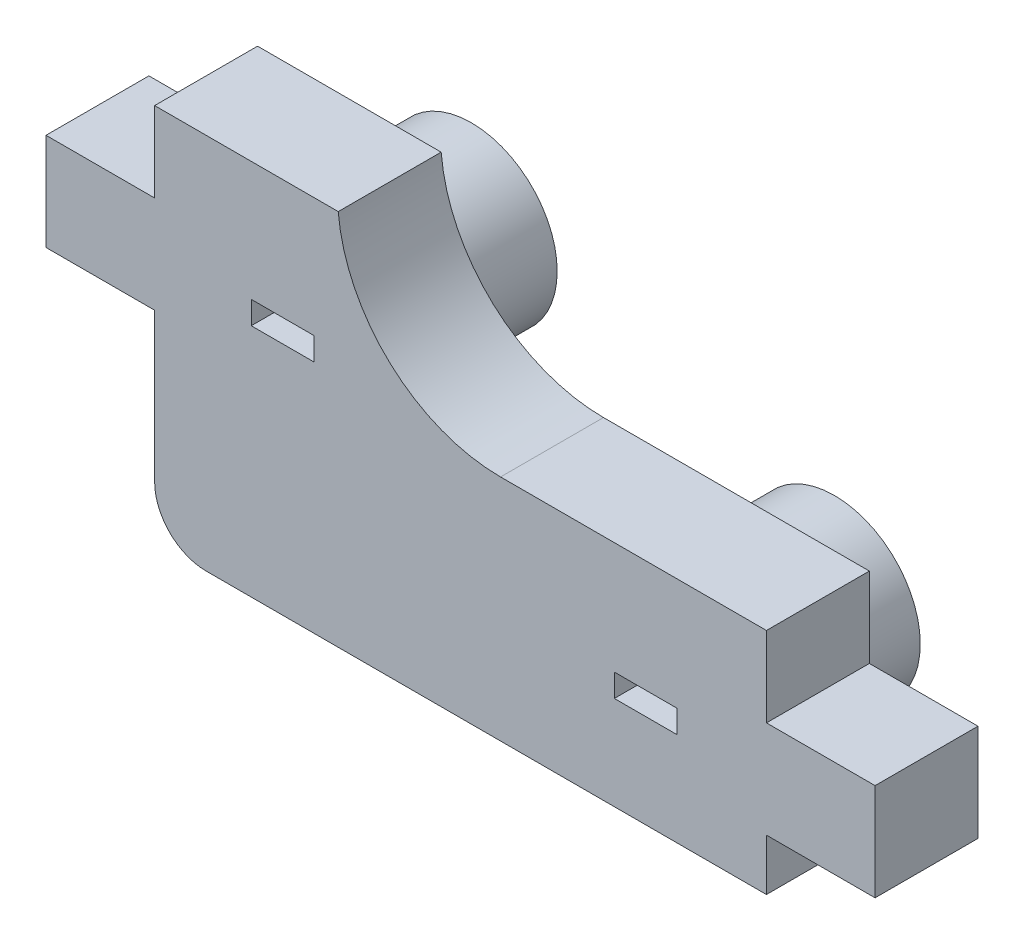
ISO-10303-21;
HEADER;
FILE_DESCRIPTION(('STEP AP214'),'2;1');
FILE_NAME('part.step','',(''),(''),'','','');
FILE_SCHEMA(('AUTOMOTIVE_DESIGN { 1 0 10303 214 1 1 1 1 }'));
ENDSEC;
DATA;
#1=APPLICATION_CONTEXT('core data for automotive mechanical design processes');
#2=APPLICATION_PROTOCOL_DEFINITION('international standard','automotive_design',2000,#1);
#3=PRODUCT_CONTEXT('',#1,'mechanical');
#4=PRODUCT('Part','Part','',(#3));
#5=PRODUCT_RELATED_PRODUCT_CATEGORY('part','',(#4));
#6=PRODUCT_DEFINITION_FORMATION('','',#4);
#7=PRODUCT_DEFINITION_CONTEXT('part definition',#1,'design');
#8=PRODUCT_DEFINITION('design','',#6,#7);
#9=PRODUCT_DEFINITION_SHAPE('','',#8);
#10=(LENGTH_UNIT() NAMED_UNIT(*) SI_UNIT(.MILLI.,.METRE.));
#11=(NAMED_UNIT(*) PLANE_ANGLE_UNIT() SI_UNIT($,.RADIAN.));
#12=(NAMED_UNIT(*) SI_UNIT($,.STERADIAN.) SOLID_ANGLE_UNIT());
#13=UNCERTAINTY_MEASURE_WITH_UNIT(LENGTH_MEASURE(1.E-05),#10,'distance_accuracy_value','');
#14=(GEOMETRIC_REPRESENTATION_CONTEXT(3) GLOBAL_UNCERTAINTY_ASSIGNED_CONTEXT((#13)) GLOBAL_UNIT_ASSIGNED_CONTEXT((#10,
#11,#12)) REPRESENTATION_CONTEXT('',''));
#15=CARTESIAN_POINT('',(0.,0.,0.));
#16=DIRECTION('',(0.,0.,1.));
#17=DIRECTION('',(1.,0.,0.));
#18=AXIS2_PLACEMENT_3D('',#15,#16,#17);
#19=CARTESIAN_POINT('',(0.,0.,1.8));
#20=DIRECTION('',(0.,0.,1.));
#21=DIRECTION('',(1.,0.,0.));
#22=AXIS2_PLACEMENT_3D('',#19,#20,#21);
#23=PLANE('',#22);
#24=DIRECTION('',(0.,-1.,0.));
#25=VECTOR('',#24,1.);
#26=CARTESIAN_POINT('',(-6.05,0.,1.8));
#27=LINE('',#26,#25);
#28=CARTESIAN_POINT('',(-6.05,-3.35,1.8));
#29=VERTEX_POINT('',#28);
#30=CARTESIAN_POINT('',(-6.05,-5.95,1.8));
#31=VERTEX_POINT('',#30);
#32=EDGE_CURVE('E271',#29,#31,#27,.T.);
#33=ORIENTED_EDGE('',*,*,#32,.T.);
#34=CARTESIAN_POINT('',(-5.15,-5.95,1.8));
#35=DIRECTION('',(0.,0.,1.));
#36=DIRECTION('',(1.,0.,0.));
#37=AXIS2_PLACEMENT_3D('',#34,#35,#36);
#38=CIRCLE('',#37,0.899999999999999);
#39=CARTESIAN_POINT('',(-5.15,-6.85,1.8));
#40=VERTEX_POINT('',#39);
#41=EDGE_CURVE('E274',#31,#40,#38,.T.);
#42=ORIENTED_EDGE('',*,*,#41,.T.);
#43=DIRECTION('',(-1.,0.,0.));
#44=VECTOR('',#43,1.);
#45=CARTESIAN_POINT('',(0.,-6.85,1.8));
#46=LINE('',#45,#44);
#47=CARTESIAN_POINT('',(4.65,-6.85,1.8));
#48=VERTEX_POINT('',#47);
#49=EDGE_CURVE('E277',#48,#40,#46,.T.);
#50=ORIENTED_EDGE('',*,*,#49,.F.);
#51=DIRECTION('',(0.,-1.,0.));
#52=VECTOR('',#51,1.);
#53=CARTESIAN_POINT('',(4.65,0.,1.8));
#54=LINE('',#53,#52);
#55=CARTESIAN_POINT('',(4.65,-5.95,1.8));
#56=VERTEX_POINT('',#55);
#57=EDGE_CURVE('E280',#56,#48,#54,.T.);
#58=ORIENTED_EDGE('',*,*,#57,.F.);
#59=DIRECTION('',(-1.,0.,0.));
#60=VECTOR('',#59,1.);
#61=CARTESIAN_POINT('',(0.,-5.95,1.8));
#62=LINE('',#61,#60);
#63=CARTESIAN_POINT('',(6.55,-5.95,1.8));
#64=VERTEX_POINT('',#63);
#65=EDGE_CURVE('E283',#64,#56,#62,.T.);
#66=ORIENTED_EDGE('',*,*,#65,.F.);
#67=DIRECTION('',(0.,-1.,0.));
#68=VECTOR('',#67,1.);
#69=CARTESIAN_POINT('',(6.55,0.,1.8));
#70=LINE('',#69,#68);
#71=CARTESIAN_POINT('',(6.55,-4.25,1.8));
#72=VERTEX_POINT('',#71);
#73=EDGE_CURVE('E286',#72,#64,#70,.T.);
#74=ORIENTED_EDGE('',*,*,#73,.F.);
#75=DIRECTION('',(1.,0.,0.));
#76=VECTOR('',#75,1.);
#77=CARTESIAN_POINT('',(0.,-4.24999999999999,1.8));
#78=LINE('',#77,#76);
#79=CARTESIAN_POINT('',(4.65,-4.25,1.8));
#80=VERTEX_POINT('',#79);
#81=EDGE_CURVE('E289',#80,#72,#78,.T.);
#82=ORIENTED_EDGE('',*,*,#81,.F.);
#83=DIRECTION('',(0.,-1.,0.));
#84=VECTOR('',#83,1.);
#85=CARTESIAN_POINT('',(4.65,0.,1.8));
#86=LINE('',#85,#84);
#87=CARTESIAN_POINT('',(4.65,-2.85,1.8));
#88=VERTEX_POINT('',#87);
#89=EDGE_CURVE('E292',#88,#80,#86,.T.);
#90=ORIENTED_EDGE('',*,*,#89,.F.);
#91=DIRECTION('',(1.,0.,0.));
#92=VECTOR('',#91,1.);
#93=CARTESIAN_POINT('',(0.,-2.85,1.8));
#94=LINE('',#93,#92);
#95=CARTESIAN_POINT('',(0.,-2.85,1.8));
#96=VERTEX_POINT('',#95);
#97=EDGE_CURVE('E295',#96,#88,#94,.T.);
#98=ORIENTED_EDGE('',*,*,#97,.F.);
#99=CARTESIAN_POINT('',(0.,0.,1.8));
#100=DIRECTION('',(0.,0.,1.));
#101=DIRECTION('',(1.,0.,0.));
#102=AXIS2_PLACEMENT_3D('',#99,#100,#101);
#103=CIRCLE('',#102,2.85);
#104=CARTESIAN_POINT('',(-2.83901391331568,-0.250000000000002,1.8));
#105=VERTEX_POINT('',#104);
#106=EDGE_CURVE('E298',#105,#96,#103,.T.);
#107=ORIENTED_EDGE('',*,*,#106,.F.);
#108=DIRECTION('',(1.,0.,0.));
#109=VECTOR('',#108,1.);
#110=CARTESIAN_POINT('',(0.,-0.250000000000002,1.8));
#111=LINE('',#110,#109);
#112=CARTESIAN_POINT('',(-6.05,-0.250000000000002,1.8));
#113=VERTEX_POINT('',#112);
#114=EDGE_CURVE('E301',#113,#105,#111,.T.);
#115=ORIENTED_EDGE('',*,*,#114,.F.);
#116=DIRECTION('',(0.,-1.,0.));
#117=VECTOR('',#116,1.);
#118=CARTESIAN_POINT('',(-6.05,0.,1.8));
#119=LINE('',#118,#117);
#120=CARTESIAN_POINT('',(-6.05,-1.65,1.8));
#121=VERTEX_POINT('',#120);
#122=EDGE_CURVE('E304',#113,#121,#119,.T.);
#123=ORIENTED_EDGE('',*,*,#122,.T.);
#124=DIRECTION('',(-1.,0.,0.));
#125=VECTOR('',#124,1.);
#126=CARTESIAN_POINT('',(0.,-1.65,1.8));
#127=LINE('',#126,#125);
#128=CARTESIAN_POINT('',(-7.95,-1.65,1.8));
#129=VERTEX_POINT('',#128);
#130=EDGE_CURVE('E306',#121,#129,#127,.T.);
#131=ORIENTED_EDGE('',*,*,#130,.T.);
#132=DIRECTION('',(0.,-1.,0.));
#133=VECTOR('',#132,1.);
#134=CARTESIAN_POINT('',(-7.95,0.,1.8));
#135=LINE('',#134,#133);
#136=CARTESIAN_POINT('',(-7.95,-3.35,1.8));
#137=VERTEX_POINT('',#136);
#138=EDGE_CURVE('E308',#129,#137,#135,.T.);
#139=ORIENTED_EDGE('',*,*,#138,.T.);
#140=DIRECTION('',(1.,0.,0.));
#141=VECTOR('',#140,1.);
#142=CARTESIAN_POINT('',(0.,-3.35,1.8));
#143=LINE('',#142,#141);
#144=EDGE_CURVE('E310',#137,#29,#143,.T.);
#145=ORIENTED_EDGE('',*,*,#144,.T.);
#146=EDGE_LOOP('',(#33,#42,#50,#58,#66,#74,#82,#90,#98,#107,#115,#123,#131,#139,#145));
#147=FACE_BOUND('',#146,.T.);
#148=DIRECTION('',(-1.,0.,0.));
#149=VECTOR('',#148,1.);
#150=CARTESIAN_POINT('',(3.08999999999999,-4.81000000000011,1.8));
#151=LINE('',#150,#149);
#152=CARTESIAN_POINT('',(3.08999999999999,-4.81000000000011,1.8));
#153=VERTEX_POINT('',#152);
#154=CARTESIAN_POINT('',(1.98999999999999,-4.81000000000011,1.8));
#155=VERTEX_POINT('',#154);
#156=EDGE_CURVE('E262',#153,#155,#151,.T.);
#157=ORIENTED_EDGE('',*,*,#156,.F.);
#158=DIRECTION('',(0.,1.,0.));
#159=VECTOR('',#158,1.);
#160=CARTESIAN_POINT('',(3.08999999999999,-5.21000000000011,1.8));
#161=LINE('',#160,#159);
#162=CARTESIAN_POINT('',(3.08999999999999,-5.21000000000011,1.8));
#163=VERTEX_POINT('',#162);
#164=EDGE_CURVE('E251',#163,#153,#161,.T.);
#165=ORIENTED_EDGE('',*,*,#164,.F.);
#166=DIRECTION('',(-1.,0.,0.));
#167=VECTOR('',#166,1.);
#168=CARTESIAN_POINT('',(3.08999999999999,-5.21000000000011,1.8));
#169=LINE('',#168,#167);
#170=CARTESIAN_POINT('',(1.98999999999999,-5.21000000000011,1.8));
#171=VERTEX_POINT('',#170);
#172=EDGE_CURVE('E246',#163,#171,#169,.T.);
#173=ORIENTED_EDGE('',*,*,#172,.T.);
#174=DIRECTION('',(0.,1.,0.));
#175=VECTOR('',#174,1.);
#176=CARTESIAN_POINT('',(1.98999999999999,-5.21000000000011,1.8));
#177=LINE('',#176,#175);
#178=EDGE_CURVE('E64',#171,#155,#177,.T.);
#179=ORIENTED_EDGE('',*,*,#178,.T.);
#180=EDGE_LOOP('',(#157,#165,#173,#179));
#181=FACE_BOUND('',#180,.T.);
#182=DIRECTION('',(-1.,0.,0.));
#183=VECTOR('',#182,1.);
#184=CARTESIAN_POINT('',(-3.25999999999998,-2.34000000000011,1.8));
#185=LINE('',#184,#183);
#186=CARTESIAN_POINT('',(-3.25999999999998,-2.34000000000011,1.8));
#187=VERTEX_POINT('',#186);
#188=CARTESIAN_POINT('',(-4.35999999999998,-2.34000000000011,1.8));
#189=VERTEX_POINT('',#188);
#190=EDGE_CURVE('E209',#187,#189,#185,.T.);
#191=ORIENTED_EDGE('',*,*,#190,.F.);
#192=DIRECTION('',(0.,1.,0.));
#193=VECTOR('',#192,1.);
#194=CARTESIAN_POINT('',(-3.25999999999998,-2.74000000000011,1.8));
#195=LINE('',#194,#193);
#196=CARTESIAN_POINT('',(-3.25999999999998,-2.74000000000011,1.8));
#197=VERTEX_POINT('',#196);
#198=EDGE_CURVE('E198',#197,#187,#195,.T.);
#199=ORIENTED_EDGE('',*,*,#198,.F.);
#200=DIRECTION('',(-1.,0.,0.));
#201=VECTOR('',#200,1.);
#202=CARTESIAN_POINT('',(-3.25999999999998,-2.74000000000011,1.8));
#203=LINE('',#202,#201);
#204=CARTESIAN_POINT('',(-4.35999999999998,-2.74000000000011,1.8));
#205=VERTEX_POINT('',#204);
#206=EDGE_CURVE('E220',#197,#205,#203,.T.);
#207=ORIENTED_EDGE('',*,*,#206,.T.);
#208=DIRECTION('',(0.,1.,0.));
#209=VECTOR('',#208,1.);
#210=CARTESIAN_POINT('',(-4.35999999999998,-2.74000000000011,1.8));
#211=LINE('',#210,#209);
#212=EDGE_CURVE('E56',#205,#189,#211,.T.);
#213=ORIENTED_EDGE('',*,*,#212,.T.);
#214=EDGE_LOOP('',(#191,#199,#207,#213));
#215=FACE_BOUND('',#214,.T.);
#216=ADVANCED_FACE('F41',(#147,#181,#215),#23,.T.);
#217=CARTESIAN_POINT('',(-6.05,0.,1.8));
#218=DIRECTION('',(1.,0.,0.));
#219=DIRECTION('',(0.,1.,0.));
#220=AXIS2_PLACEMENT_3D('',#217,#218,#219);
#221=PLANE('',#220);
#222=DIRECTION('',(0.,-1.,0.));
#223=VECTOR('',#222,1.);
#224=CARTESIAN_POINT('',(-6.05,0.,0.));
#225=LINE('',#224,#223);
#226=CARTESIAN_POINT('',(-6.05,-3.35,0.));
#227=VERTEX_POINT('',#226);
#228=CARTESIAN_POINT('',(-6.05,-5.95,0.));
#229=VERTEX_POINT('',#228);
#230=EDGE_CURVE('E270',#227,#229,#225,.T.);
#231=ORIENTED_EDGE('',*,*,#230,.T.);
#232=DIRECTION('',(0.,0.,-1.));
#233=VECTOR('',#232,1.);
#234=CARTESIAN_POINT('',(-6.05,-5.95,1.8));
#235=LINE('',#234,#233);
#236=EDGE_CURVE('E383',#31,#229,#235,.T.);
#237=ORIENTED_EDGE('',*,*,#236,.F.);
#238=ORIENTED_EDGE('',*,*,#32,.F.);
#239=DIRECTION('',(0.,0.,-1.));
#240=VECTOR('',#239,1.);
#241=CARTESIAN_POINT('',(-6.05,-3.35,1.8));
#242=LINE('',#241,#240);
#243=EDGE_CURVE('E312',#29,#227,#242,.T.);
#244=ORIENTED_EDGE('',*,*,#243,.T.);
#245=EDGE_LOOP('',(#231,#237,#238,#244));
#246=FACE_BOUND('',#245,.T.);
#247=ADVANCED_FACE('F43',(#246),#221,.F.);
#248=CARTESIAN_POINT('',(-5.15,-5.95,1.8));
#249=DIRECTION('',(0.,0.,-1.));
#250=DIRECTION('',(-1.,0.,0.));
#251=AXIS2_PLACEMENT_3D('',#248,#249,#250);
#252=CYLINDRICAL_SURFACE('',#251,0.899999999999999);
#253=CARTESIAN_POINT('',(-5.15,-5.95,0.));
#254=DIRECTION('',(0.,0.,1.));
#255=DIRECTION('',(1.,0.,0.));
#256=AXIS2_PLACEMENT_3D('',#253,#254,#255);
#257=CIRCLE('',#256,0.899999999999999);
#258=CARTESIAN_POINT('',(-5.15,-6.85,0.));
#259=VERTEX_POINT('',#258);
#260=EDGE_CURVE('E315',#229,#259,#257,.T.);
#261=ORIENTED_EDGE('',*,*,#260,.T.);
#262=DIRECTION('',(0.,0.,-1.));
#263=VECTOR('',#262,1.);
#264=CARTESIAN_POINT('',(-5.15,-6.85,1.8));
#265=LINE('',#264,#263);
#266=EDGE_CURVE('E381',#40,#259,#265,.T.);
#267=ORIENTED_EDGE('',*,*,#266,.F.);
#268=ORIENTED_EDGE('',*,*,#41,.F.);
#269=ORIENTED_EDGE('',*,*,#236,.T.);
#270=EDGE_LOOP('',(#261,#267,#268,#269));
#271=FACE_BOUND('',#270,.T.);
#272=ADVANCED_FACE('F457',(#271),#252,.T.);
#273=CARTESIAN_POINT('',(0.,-6.85,1.8));
#274=DIRECTION('',(0.,-1.,0.));
#275=DIRECTION('',(1.,0.,0.));
#276=AXIS2_PLACEMENT_3D('',#273,#274,#275);
#277=PLANE('',#276);
#278=DIRECTION('',(-1.,0.,0.));
#279=VECTOR('',#278,1.);
#280=CARTESIAN_POINT('',(0.,-6.85,0.));
#281=LINE('',#280,#279);
#282=CARTESIAN_POINT('',(4.65,-6.85,0.));
#283=VERTEX_POINT('',#282);
#284=EDGE_CURVE('E318',#283,#259,#281,.T.);
#285=ORIENTED_EDGE('',*,*,#284,.F.);
#286=DIRECTION('',(0.,0.,-1.));
#287=VECTOR('',#286,1.);
#288=CARTESIAN_POINT('',(4.65,-6.85,1.8));
#289=LINE('',#288,#287);
#290=EDGE_CURVE('E379',#48,#283,#289,.T.);
#291=ORIENTED_EDGE('',*,*,#290,.F.);
#292=ORIENTED_EDGE('',*,*,#49,.T.);
#293=ORIENTED_EDGE('',*,*,#266,.T.);
#294=EDGE_LOOP('',(#285,#291,#292,#293));
#295=FACE_BOUND('',#294,.T.);
#296=ADVANCED_FACE('F454',(#295),#277,.T.);
#297=CARTESIAN_POINT('',(4.65,0.,1.8));
#298=DIRECTION('',(1.,0.,0.));
#299=DIRECTION('',(0.,0.,-1.));
#300=AXIS2_PLACEMENT_3D('',#297,#298,#299);
#301=PLANE('',#300);
#302=DIRECTION('',(0.,-1.,0.));
#303=VECTOR('',#302,1.);
#304=CARTESIAN_POINT('',(4.65,0.,0.));
#305=LINE('',#304,#303);
#306=CARTESIAN_POINT('',(4.65,-5.95,0.));
#307=VERTEX_POINT('',#306);
#308=EDGE_CURVE('E321',#307,#283,#305,.T.);
#309=ORIENTED_EDGE('',*,*,#308,.F.);
#310=DIRECTION('',(0.,0.,-1.));
#311=VECTOR('',#310,1.);
#312=CARTESIAN_POINT('',(4.65,-5.95,1.8));
#313=LINE('',#312,#311);
#314=EDGE_CURVE('E377',#56,#307,#313,.T.);
#315=ORIENTED_EDGE('',*,*,#314,.F.);
#316=ORIENTED_EDGE('',*,*,#57,.T.);
#317=ORIENTED_EDGE('',*,*,#290,.T.);
#318=EDGE_LOOP('',(#309,#315,#316,#317));
#319=FACE_BOUND('',#318,.T.);
#320=ADVANCED_FACE('F450',(#319),#301,.T.);
#321=CARTESIAN_POINT('',(0.,-5.95,1.8));
#322=DIRECTION('',(0.,-1.,0.));
#323=DIRECTION('',(0.,0.,-1.));
#324=AXIS2_PLACEMENT_3D('',#321,#322,#323);
#325=PLANE('',#324);
#326=DIRECTION('',(-1.,0.,0.));
#327=VECTOR('',#326,1.);
#328=CARTESIAN_POINT('',(0.,-5.95,0.));
#329=LINE('',#328,#327);
#330=CARTESIAN_POINT('',(6.55,-5.95,0.));
#331=VERTEX_POINT('',#330);
#332=EDGE_CURVE('E324',#331,#307,#329,.T.);
#333=ORIENTED_EDGE('',*,*,#332,.F.);
#334=DIRECTION('',(0.,0.,-1.));
#335=VECTOR('',#334,1.);
#336=CARTESIAN_POINT('',(6.55,-5.95,1.8));
#337=LINE('',#336,#335);
#338=EDGE_CURVE('E375',#64,#331,#337,.T.);
#339=ORIENTED_EDGE('',*,*,#338,.F.);
#340=ORIENTED_EDGE('',*,*,#65,.T.);
#341=ORIENTED_EDGE('',*,*,#314,.T.);
#342=EDGE_LOOP('',(#333,#339,#340,#341));
#343=FACE_BOUND('',#342,.T.);
#344=ADVANCED_FACE('F446',(#343),#325,.T.);
#345=CARTESIAN_POINT('',(6.55,0.,1.8));
#346=DIRECTION('',(1.,0.,0.));
#347=DIRECTION('',(0.,0.,-1.));
#348=AXIS2_PLACEMENT_3D('',#345,#346,#347);
#349=PLANE('',#348);
#350=DIRECTION('',(0.,-1.,0.));
#351=VECTOR('',#350,1.);
#352=CARTESIAN_POINT('',(6.55,0.,0.));
#353=LINE('',#352,#351);
#354=CARTESIAN_POINT('',(6.55,-4.25,0.));
#355=VERTEX_POINT('',#354);
#356=EDGE_CURVE('E327',#355,#331,#353,.T.);
#357=ORIENTED_EDGE('',*,*,#356,.F.);
#358=DIRECTION('',(0.,0.,-1.));
#359=VECTOR('',#358,1.);
#360=CARTESIAN_POINT('',(6.55,-4.25,1.8));
#361=LINE('',#360,#359);
#362=EDGE_CURVE('E373',#72,#355,#361,.T.);
#363=ORIENTED_EDGE('',*,*,#362,.F.);
#364=ORIENTED_EDGE('',*,*,#73,.T.);
#365=ORIENTED_EDGE('',*,*,#338,.T.);
#366=EDGE_LOOP('',(#357,#363,#364,#365));
#367=FACE_BOUND('',#366,.T.);
#368=ADVANCED_FACE('F442',(#367),#349,.T.);
#369=CARTESIAN_POINT('',(0.,-4.24999999999999,1.8));
#370=DIRECTION('',(0.,1.,0.));
#371=DIRECTION('',(-1.,0.,0.));
#372=AXIS2_PLACEMENT_3D('',#369,#370,#371);
#373=PLANE('',#372);
#374=DIRECTION('',(1.,0.,0.));
#375=VECTOR('',#374,1.);
#376=CARTESIAN_POINT('',(0.,-4.24999999999999,0.));
#377=LINE('',#376,#375);
#378=CARTESIAN_POINT('',(4.65,-4.25,0.));
#379=VERTEX_POINT('',#378);
#380=EDGE_CURVE('E330',#379,#355,#377,.T.);
#381=ORIENTED_EDGE('',*,*,#380,.F.);
#382=DIRECTION('',(0.,0.,-1.));
#383=VECTOR('',#382,1.);
#384=CARTESIAN_POINT('',(4.65,-4.25,1.8));
#385=LINE('',#384,#383);
#386=EDGE_CURVE('E371',#80,#379,#385,.T.);
#387=ORIENTED_EDGE('',*,*,#386,.F.);
#388=ORIENTED_EDGE('',*,*,#81,.T.);
#389=ORIENTED_EDGE('',*,*,#362,.T.);
#390=EDGE_LOOP('',(#381,#387,#388,#389));
#391=FACE_BOUND('',#390,.T.);
#392=ADVANCED_FACE('F438',(#391),#373,.T.);
#393=CARTESIAN_POINT('',(4.65,0.,1.8));
#394=DIRECTION('',(1.,0.,0.));
#395=DIRECTION('',(0.,0.,-1.));
#396=AXIS2_PLACEMENT_3D('',#393,#394,#395);
#397=PLANE('',#396);
#398=DIRECTION('',(0.,-1.,0.));
#399=VECTOR('',#398,1.);
#400=CARTESIAN_POINT('',(4.65,0.,0.));
#401=LINE('',#400,#399);
#402=CARTESIAN_POINT('',(4.65,-2.85,0.));
#403=VERTEX_POINT('',#402);
#404=EDGE_CURVE('E333',#403,#379,#401,.T.);
#405=ORIENTED_EDGE('',*,*,#404,.F.);
#406=DIRECTION('',(0.,0.,-1.));
#407=VECTOR('',#406,1.);
#408=CARTESIAN_POINT('',(4.65,-2.85,1.8));
#409=LINE('',#408,#407);
#410=EDGE_CURVE('E369',#88,#403,#409,.T.);
#411=ORIENTED_EDGE('',*,*,#410,.F.);
#412=ORIENTED_EDGE('',*,*,#89,.T.);
#413=ORIENTED_EDGE('',*,*,#386,.T.);
#414=EDGE_LOOP('',(#405,#411,#412,#413));
#415=FACE_BOUND('',#414,.T.);
#416=ADVANCED_FACE('F434',(#415),#397,.T.);
#417=CARTESIAN_POINT('',(0.,-2.85,1.8));
#418=DIRECTION('',(0.,1.,0.));
#419=DIRECTION('',(0.,0.,1.));
#420=AXIS2_PLACEMENT_3D('',#417,#418,#419);
#421=PLANE('',#420);
#422=DIRECTION('',(1.,0.,0.));
#423=VECTOR('',#422,1.);
#424=CARTESIAN_POINT('',(0.,-2.85,0.));
#425=LINE('',#424,#423);
#426=CARTESIAN_POINT('',(0.,-2.85,0.));
#427=VERTEX_POINT('',#426);
#428=EDGE_CURVE('E336',#427,#403,#425,.T.);
#429=ORIENTED_EDGE('',*,*,#428,.F.);
#430=DIRECTION('',(0.,0.,-1.));
#431=VECTOR('',#430,1.);
#432=CARTESIAN_POINT('',(0.,-2.85,1.8));
#433=LINE('',#432,#431);
#434=EDGE_CURVE('E367',#96,#427,#433,.T.);
#435=ORIENTED_EDGE('',*,*,#434,.F.);
#436=ORIENTED_EDGE('',*,*,#97,.T.);
#437=ORIENTED_EDGE('',*,*,#410,.T.);
#438=EDGE_LOOP('',(#429,#435,#436,#437));
#439=FACE_BOUND('',#438,.T.);
#440=ADVANCED_FACE('F430',(#439),#421,.T.);
#441=CARTESIAN_POINT('',(0.,0.,1.8));
#442=DIRECTION('',(0.,0.,-1.));
#443=DIRECTION('',(-1.,0.,0.));
#444=AXIS2_PLACEMENT_3D('',#441,#442,#443);
#445=CYLINDRICAL_SURFACE('',#444,2.85);
#446=CARTESIAN_POINT('',(0.,0.,0.));
#447=DIRECTION('',(0.,0.,1.));
#448=DIRECTION('',(1.,0.,0.));
#449=AXIS2_PLACEMENT_3D('',#446,#447,#448);
#450=CIRCLE('',#449,2.85);
#451=CARTESIAN_POINT('',(-2.83901391331568,-0.250000000000002,0.));
#452=VERTEX_POINT('',#451);
#453=EDGE_CURVE('E339',#452,#427,#450,.T.);
#454=ORIENTED_EDGE('',*,*,#453,.F.);
#455=DIRECTION('',(0.,0.,-1.));
#456=VECTOR('',#455,1.);
#457=CARTESIAN_POINT('',(-2.83901391331568,-0.250000000000002,1.8));
#458=LINE('',#457,#456);
#459=EDGE_CURVE('E365',#105,#452,#458,.T.);
#460=ORIENTED_EDGE('',*,*,#459,.F.);
#461=ORIENTED_EDGE('',*,*,#106,.T.);
#462=ORIENTED_EDGE('',*,*,#434,.T.);
#463=EDGE_LOOP('',(#454,#460,#461,#462));
#464=FACE_BOUND('',#463,.T.);
#465=ADVANCED_FACE('F426',(#464),#445,.F.);
#466=CARTESIAN_POINT('',(0.,-0.250000000000002,1.8));
#467=DIRECTION('',(0.,1.,0.));
#468=DIRECTION('',(-1.,0.,0.));
#469=AXIS2_PLACEMENT_3D('',#466,#467,#468);
#470=PLANE('',#469);
#471=DIRECTION('',(1.,0.,0.));
#472=VECTOR('',#471,1.);
#473=CARTESIAN_POINT('',(0.,-0.250000000000002,0.));
#474=LINE('',#473,#472);
#475=CARTESIAN_POINT('',(-6.05,-0.250000000000002,0.));
#476=VERTEX_POINT('',#475);
#477=EDGE_CURVE('E342',#476,#452,#474,.T.);
#478=ORIENTED_EDGE('',*,*,#477,.F.);
#479=DIRECTION('',(0.,0.,-1.));
#480=VECTOR('',#479,1.);
#481=CARTESIAN_POINT('',(-6.05,-0.250000000000002,1.8));
#482=LINE('',#481,#480);
#483=EDGE_CURVE('E363',#113,#476,#482,.T.);
#484=ORIENTED_EDGE('',*,*,#483,.F.);
#485=ORIENTED_EDGE('',*,*,#114,.T.);
#486=ORIENTED_EDGE('',*,*,#459,.T.);
#487=EDGE_LOOP('',(#478,#484,#485,#486));
#488=FACE_BOUND('',#487,.T.);
#489=ADVANCED_FACE('F422',(#488),#470,.T.);
#490=CARTESIAN_POINT('',(-6.05,0.,1.8));
#491=DIRECTION('',(1.,0.,0.));
#492=DIRECTION('',(0.,0.,-1.));
#493=AXIS2_PLACEMENT_3D('',#490,#491,#492);
#494=PLANE('',#493);
#495=DIRECTION('',(0.,-1.,0.));
#496=VECTOR('',#495,1.);
#497=CARTESIAN_POINT('',(-6.05,0.,0.));
#498=LINE('',#497,#496);
#499=CARTESIAN_POINT('',(-6.05,-1.65,0.));
#500=VERTEX_POINT('',#499);
#501=EDGE_CURVE('E345',#476,#500,#498,.T.);
#502=ORIENTED_EDGE('',*,*,#501,.T.);
#503=DIRECTION('',(0.,0.,-1.));
#504=VECTOR('',#503,1.);
#505=CARTESIAN_POINT('',(-6.05,-1.65,1.8));
#506=LINE('',#505,#504);
#507=EDGE_CURVE('E360',#121,#500,#506,.T.);
#508=ORIENTED_EDGE('',*,*,#507,.F.);
#509=ORIENTED_EDGE('',*,*,#122,.F.);
#510=ORIENTED_EDGE('',*,*,#483,.T.);
#511=EDGE_LOOP('',(#502,#508,#509,#510));
#512=FACE_BOUND('',#511,.T.);
#513=ADVANCED_FACE('F419',(#512),#494,.F.);
#514=CARTESIAN_POINT('',(0.,-1.65,1.8));
#515=DIRECTION('',(0.,-1.,0.));
#516=DIRECTION('',(0.,0.,-1.));
#517=AXIS2_PLACEMENT_3D('',#514,#515,#516);
#518=PLANE('',#517);
#519=DIRECTION('',(-1.,0.,0.));
#520=VECTOR('',#519,1.);
#521=CARTESIAN_POINT('',(0.,-1.65,0.));
#522=LINE('',#521,#520);
#523=CARTESIAN_POINT('',(-7.95,-1.65,0.));
#524=VERTEX_POINT('',#523);
#525=EDGE_CURVE('E347',#500,#524,#522,.T.);
#526=ORIENTED_EDGE('',*,*,#525,.T.);
#527=DIRECTION('',(0.,0.,-1.));
#528=VECTOR('',#527,1.);
#529=CARTESIAN_POINT('',(-7.95,-1.65,1.8));
#530=LINE('',#529,#528);
#531=EDGE_CURVE('E357',#129,#524,#530,.T.);
#532=ORIENTED_EDGE('',*,*,#531,.F.);
#533=ORIENTED_EDGE('',*,*,#130,.F.);
#534=ORIENTED_EDGE('',*,*,#507,.T.);
#535=EDGE_LOOP('',(#526,#532,#533,#534));
#536=FACE_BOUND('',#535,.T.);
#537=ADVANCED_FACE('F414',(#536),#518,.F.);
#538=CARTESIAN_POINT('',(-7.95,0.,1.8));
#539=DIRECTION('',(1.,0.,0.));
#540=DIRECTION('',(0.,0.,-1.));
#541=AXIS2_PLACEMENT_3D('',#538,#539,#540);
#542=PLANE('',#541);
#543=DIRECTION('',(0.,-1.,0.));
#544=VECTOR('',#543,1.);
#545=CARTESIAN_POINT('',(-7.95,0.,0.));
#546=LINE('',#545,#544);
#547=CARTESIAN_POINT('',(-7.95,-3.35,0.));
#548=VERTEX_POINT('',#547);
#549=EDGE_CURVE('E349',#524,#548,#546,.T.);
#550=ORIENTED_EDGE('',*,*,#549,.T.);
#551=DIRECTION('',(0.,0.,-1.));
#552=VECTOR('',#551,1.);
#553=CARTESIAN_POINT('',(-7.95,-3.35,1.8));
#554=LINE('',#553,#552);
#555=EDGE_CURVE('E354',#137,#548,#554,.T.);
#556=ORIENTED_EDGE('',*,*,#555,.F.);
#557=ORIENTED_EDGE('',*,*,#138,.F.);
#558=ORIENTED_EDGE('',*,*,#531,.T.);
#559=EDGE_LOOP('',(#550,#556,#557,#558));
#560=FACE_BOUND('',#559,.T.);
#561=ADVANCED_FACE('F408',(#560),#542,.F.);
#562=CARTESIAN_POINT('',(0.,-3.35,1.8));
#563=DIRECTION('',(0.,1.,0.));
#564=DIRECTION('',(0.,0.,1.));
#565=AXIS2_PLACEMENT_3D('',#562,#563,#564);
#566=PLANE('',#565);
#567=DIRECTION('',(1.,0.,0.));
#568=VECTOR('',#567,1.);
#569=CARTESIAN_POINT('',(0.,-3.35,0.));
#570=LINE('',#569,#568);
#571=EDGE_CURVE('E275',#548,#227,#570,.T.);
#572=ORIENTED_EDGE('',*,*,#571,.T.);
#573=ORIENTED_EDGE('',*,*,#243,.F.);
#574=ORIENTED_EDGE('',*,*,#144,.F.);
#575=ORIENTED_EDGE('',*,*,#555,.T.);
#576=EDGE_LOOP('',(#572,#573,#574,#575));
#577=FACE_BOUND('',#576,.T.);
#578=ADVANCED_FACE('F393',(#577),#566,.F.);
#579=CARTESIAN_POINT('',(0.,0.,0.));
#580=DIRECTION('',(0.,0.,1.));
#581=DIRECTION('',(1.,0.,0.));
#582=AXIS2_PLACEMENT_3D('',#579,#580,#581);
#583=PLANE('',#582);
#584=CARTESIAN_POINT('',(2.53999999999999,-5.01000000000011,0.));
#585=DIRECTION('',(0.,0.,1.));
#586=DIRECTION('',(1.,0.,0.));
#587=AXIS2_PLACEMENT_3D('',#584,#585,#586);
#588=CIRCLE('',#587,1.5);
#589=CARTESIAN_POINT('',(4.03999999999999,-5.01000000000011,0.));
#590=VERTEX_POINT('',#589);
#591=EDGE_CURVE('E11',#590,#590,#588,.F.);
#592=ORIENTED_EDGE('',*,*,#591,.F.);
#593=EDGE_LOOP('',(#592));
#594=FACE_BOUND('',#593,.T.);
#595=CARTESIAN_POINT('',(-3.80999999999998,-2.54000000000011,0.));
#596=DIRECTION('',(0.,0.,1.));
#597=DIRECTION('',(1.,0.,0.));
#598=AXIS2_PLACEMENT_3D('',#595,#596,#597);
#599=CIRCLE('',#598,1.5);
#600=CARTESIAN_POINT('',(-2.30999999999998,-2.54000000000011,0.));
#601=VERTEX_POINT('',#600);
#602=EDGE_CURVE('E49',#601,#601,#599,.F.);
#603=ORIENTED_EDGE('',*,*,#602,.F.);
#604=EDGE_LOOP('',(#603));
#605=FACE_BOUND('',#604,.T.);
#606=ORIENTED_EDGE('',*,*,#230,.F.);
#607=ORIENTED_EDGE('',*,*,#571,.F.);
#608=ORIENTED_EDGE('',*,*,#549,.F.);
#609=ORIENTED_EDGE('',*,*,#525,.F.);
#610=ORIENTED_EDGE('',*,*,#501,.F.);
#611=ORIENTED_EDGE('',*,*,#477,.T.);
#612=ORIENTED_EDGE('',*,*,#453,.T.);
#613=ORIENTED_EDGE('',*,*,#428,.T.);
#614=ORIENTED_EDGE('',*,*,#404,.T.);
#615=ORIENTED_EDGE('',*,*,#380,.T.);
#616=ORIENTED_EDGE('',*,*,#356,.T.);
#617=ORIENTED_EDGE('',*,*,#332,.T.);
#618=ORIENTED_EDGE('',*,*,#308,.T.);
#619=ORIENTED_EDGE('',*,*,#284,.T.);
#620=ORIENTED_EDGE('',*,*,#260,.F.);
#621=EDGE_LOOP('',(#606,#607,#608,#609,#610,#611,#612,#613,#614,#615,#616,#617,#618,#619,#620));
#622=FACE_BOUND('',#621,.T.);
#623=ADVANCED_FACE('F390',(#594,#605,#622),#583,.F.);
#624=CARTESIAN_POINT('',(-3.80999999999998,-2.54000000000011,-1.5));
#625=DIRECTION('',(0.,0.,1.));
#626=DIRECTION('',(1.,0.,0.));
#627=AXIS2_PLACEMENT_3D('',#624,#625,#626);
#628=CYLINDRICAL_SURFACE('',#627,1.5);
#629=CARTESIAN_POINT('',(-3.80999999999998,-2.54000000000011,-1.5));
#630=DIRECTION('',(0.,0.,-1.));
#631=DIRECTION('',(-1.,0.,0.));
#632=AXIS2_PLACEMENT_3D('',#629,#630,#631);
#633=CIRCLE('',#632,1.5);
#634=CARTESIAN_POINT('',(-5.30999999999998,-2.54000000000011,-1.5));
#635=VERTEX_POINT('',#634);
#636=EDGE_CURVE('E267',#635,#635,#633,.T.);
#637=ORIENTED_EDGE('',*,*,#636,.F.);
#638=EDGE_LOOP('',(#637));
#639=FACE_BOUND('',#638,.T.);
#640=ORIENTED_EDGE('',*,*,#602,.T.);
#641=EDGE_LOOP('',(#640));
#642=FACE_BOUND('',#641,.T.);
#643=ADVANCED_FACE('F388',(#639,#642),#628,.T.);
#644=CARTESIAN_POINT('',(-3.80999999999998,-2.54000000000011,-1.5));
#645=DIRECTION('',(0.,0.,-1.));
#646=DIRECTION('',(-1.,0.,0.));
#647=AXIS2_PLACEMENT_3D('',#644,#645,#646);
#648=PLANE('',#647);
#649=ORIENTED_EDGE('',*,*,#636,.T.);
#650=EDGE_LOOP('',(#649));
#651=FACE_BOUND('',#650,.T.);
#652=ADVANCED_FACE('F499',(#651),#648,.T.);
#653=CARTESIAN_POINT('',(2.53999999999999,-5.01000000000011,-1.5));
#654=DIRECTION('',(0.,0.,1.));
#655=DIRECTION('',(1.,0.,0.));
#656=AXIS2_PLACEMENT_3D('',#653,#654,#655);
#657=CYLINDRICAL_SURFACE('',#656,1.5);
#658=CARTESIAN_POINT('',(2.53999999999999,-5.01000000000011,-1.5));
#659=DIRECTION('',(0.,0.,-1.));
#660=DIRECTION('',(-1.,0.,0.));
#661=AXIS2_PLACEMENT_3D('',#658,#659,#660);
#662=CIRCLE('',#661,1.5);
#663=CARTESIAN_POINT('',(1.03999999999999,-5.01000000000011,-1.5));
#664=VERTEX_POINT('',#663);
#665=EDGE_CURVE('E216',#664,#664,#662,.T.);
#666=ORIENTED_EDGE('',*,*,#665,.F.);
#667=EDGE_LOOP('',(#666));
#668=FACE_BOUND('',#667,.T.);
#669=ORIENTED_EDGE('',*,*,#591,.T.);
#670=EDGE_LOOP('',(#669));
#671=FACE_BOUND('',#670,.T.);
#672=ADVANCED_FACE('F486',(#668,#671),#657,.T.);
#673=CARTESIAN_POINT('',(2.53999999999999,-5.01000000000011,-1.5));
#674=DIRECTION('',(0.,0.,-1.));
#675=DIRECTION('',(-1.,0.,0.));
#676=AXIS2_PLACEMENT_3D('',#673,#674,#675);
#677=PLANE('',#676);
#678=ORIENTED_EDGE('',*,*,#665,.T.);
#679=EDGE_LOOP('',(#678));
#680=FACE_BOUND('',#679,.T.);
#681=ADVANCED_FACE('F479',(#680),#677,.T.);
#682=CARTESIAN_POINT('',(3.08999999999999,-5.21000000000011,1.8));
#683=DIRECTION('',(-1.,0.,0.));
#684=DIRECTION('',(0.,0.,1.));
#685=AXIS2_PLACEMENT_3D('',#682,#683,#684);
#686=PLANE('',#685);
#687=DIRECTION('',(0.,1.,0.));
#688=VECTOR('',#687,1.);
#689=CARTESIAN_POINT('',(3.08999999999999,-5.21000000000011,0.));
#690=LINE('',#689,#688);
#691=CARTESIAN_POINT('',(3.08999999999999,-5.21000000000011,0.));
#692=VERTEX_POINT('',#691);
#693=CARTESIAN_POINT('',(3.08999999999999,-4.81000000000011,0.));
#694=VERTEX_POINT('',#693);
#695=EDGE_CURVE('E226',#692,#694,#690,.T.);
#696=ORIENTED_EDGE('',*,*,#695,.F.);
#697=DIRECTION('',(0.,0.,-1.));
#698=VECTOR('',#697,1.);
#699=CARTESIAN_POINT('',(3.08999999999999,-5.21000000000011,1.8));
#700=LINE('',#699,#698);
#701=EDGE_CURVE('E244',#163,#692,#700,.T.);
#702=ORIENTED_EDGE('',*,*,#701,.F.);
#703=ORIENTED_EDGE('',*,*,#164,.T.);
#704=DIRECTION('',(0.,0.,-1.));
#705=VECTOR('',#704,1.);
#706=CARTESIAN_POINT('',(3.08999999999999,-4.81000000000011,1.8));
#707=LINE('',#706,#705);
#708=EDGE_CURVE('E237',#153,#694,#707,.T.);
#709=ORIENTED_EDGE('',*,*,#708,.T.);
#710=EDGE_LOOP('',(#696,#702,#703,#709));
#711=FACE_BOUND('',#710,.T.);
#712=ADVANCED_FACE('F477',(#711),#686,.T.);
#713=CARTESIAN_POINT('',(3.08999999999999,-4.81000000000011,1.8));
#714=DIRECTION('',(0.,-1.,0.));
#715=DIRECTION('',(0.,0.,-1.));
#716=AXIS2_PLACEMENT_3D('',#713,#714,#715);
#717=PLANE('',#716);
#718=DIRECTION('',(-1.,0.,0.));
#719=VECTOR('',#718,1.);
#720=CARTESIAN_POINT('',(3.08999999999999,-4.81000000000011,0.));
#721=LINE('',#720,#719);
#722=CARTESIAN_POINT('',(1.98999999999999,-4.81000000000011,0.));
#723=VERTEX_POINT('',#722);
#724=EDGE_CURVE('E254',#694,#723,#721,.T.);
#725=ORIENTED_EDGE('',*,*,#724,.F.);
#726=ORIENTED_EDGE('',*,*,#708,.F.);
#727=ORIENTED_EDGE('',*,*,#156,.T.);
#728=DIRECTION('',(0.,0.,-1.));
#729=VECTOR('',#728,1.);
#730=CARTESIAN_POINT('',(1.98999999999999,-4.81000000000011,1.8));
#731=LINE('',#730,#729);
#732=EDGE_CURVE('E240',#155,#723,#731,.T.);
#733=ORIENTED_EDGE('',*,*,#732,.T.);
#734=EDGE_LOOP('',(#725,#726,#727,#733));
#735=FACE_BOUND('',#734,.T.);
#736=ADVANCED_FACE('F466',(#735),#717,.T.);
#737=CARTESIAN_POINT('',(1.98999999999999,-5.21000000000011,1.8));
#738=DIRECTION('',(-1.,0.,0.));
#739=DIRECTION('',(0.,-1.,0.));
#740=AXIS2_PLACEMENT_3D('',#737,#738,#739);
#741=PLANE('',#740);
#742=DIRECTION('',(0.,1.,0.));
#743=VECTOR('',#742,1.);
#744=CARTESIAN_POINT('',(1.98999999999999,-5.21000000000011,0.));
#745=LINE('',#744,#743);
#746=CARTESIAN_POINT('',(1.98999999999999,-5.21000000000011,0.));
#747=VERTEX_POINT('',#746);
#748=EDGE_CURVE('E250',#747,#723,#745,.T.);
#749=ORIENTED_EDGE('',*,*,#748,.T.);
#750=ORIENTED_EDGE('',*,*,#732,.F.);
#751=ORIENTED_EDGE('',*,*,#178,.F.);
#752=DIRECTION('',(0.,0.,-1.));
#753=VECTOR('',#752,1.);
#754=CARTESIAN_POINT('',(1.98999999999999,-5.21000000000011,1.8));
#755=LINE('',#754,#753);
#756=EDGE_CURVE('E242',#171,#747,#755,.T.);
#757=ORIENTED_EDGE('',*,*,#756,.T.);
#758=EDGE_LOOP('',(#749,#750,#751,#757));
#759=FACE_BOUND('',#758,.T.);
#760=ADVANCED_FACE('F467',(#759),#741,.F.);
#761=CARTESIAN_POINT('',(3.08999999999999,-5.21000000000011,1.8));
#762=DIRECTION('',(0.,-1.,0.));
#763=DIRECTION('',(0.,0.,-1.));
#764=AXIS2_PLACEMENT_3D('',#761,#762,#763);
#765=PLANE('',#764);
#766=DIRECTION('',(-1.,0.,0.));
#767=VECTOR('',#766,1.);
#768=CARTESIAN_POINT('',(3.08999999999999,-5.21000000000011,0.));
#769=LINE('',#768,#767);
#770=EDGE_CURVE('E247',#692,#747,#769,.T.);
#771=ORIENTED_EDGE('',*,*,#770,.T.);
#772=ORIENTED_EDGE('',*,*,#756,.F.);
#773=ORIENTED_EDGE('',*,*,#172,.F.);
#774=ORIENTED_EDGE('',*,*,#701,.T.);
#775=EDGE_LOOP('',(#771,#772,#773,#774));
#776=FACE_BOUND('',#775,.T.);
#777=ADVANCED_FACE('F473',(#776),#765,.F.);
#778=CARTESIAN_POINT('',(0.,0.,0.));
#779=DIRECTION('',(0.,0.,1.));
#780=DIRECTION('',(1.,0.,0.));
#781=AXIS2_PLACEMENT_3D('',#778,#779,#780);
#782=PLANE('',#781);
#783=ORIENTED_EDGE('',*,*,#695,.T.);
#784=ORIENTED_EDGE('',*,*,#724,.T.);
#785=ORIENTED_EDGE('',*,*,#748,.F.);
#786=ORIENTED_EDGE('',*,*,#770,.F.);
#787=EDGE_LOOP('',(#783,#784,#785,#786));
#788=FACE_BOUND('',#787,.T.);
#789=ADVANCED_FACE('F471',(#788),#782,.T.);
#790=CARTESIAN_POINT('',(-3.25999999999998,-2.74000000000011,1.8));
#791=DIRECTION('',(-1.,0.,0.));
#792=DIRECTION('',(0.,0.,1.));
#793=AXIS2_PLACEMENT_3D('',#790,#791,#792);
#794=PLANE('',#793);
#795=DIRECTION('',(0.,1.,0.));
#796=VECTOR('',#795,1.);
#797=CARTESIAN_POINT('',(-3.25999999999998,-2.74000000000011,0.));
#798=LINE('',#797,#796);
#799=CARTESIAN_POINT('',(-3.25999999999998,-2.74000000000011,0.));
#800=VERTEX_POINT('',#799);
#801=CARTESIAN_POINT('',(-3.25999999999998,-2.34000000000011,0.));
#802=VERTEX_POINT('',#801);
#803=EDGE_CURVE('E224',#800,#802,#798,.T.);
#804=ORIENTED_EDGE('',*,*,#803,.F.);
#805=DIRECTION('',(0.,0.,-1.));
#806=VECTOR('',#805,1.);
#807=CARTESIAN_POINT('',(-3.25999999999998,-2.74000000000011,1.8));
#808=LINE('',#807,#806);
#809=EDGE_CURVE('E204',#197,#800,#808,.T.);
#810=ORIENTED_EDGE('',*,*,#809,.F.);
#811=ORIENTED_EDGE('',*,*,#198,.T.);
#812=DIRECTION('',(0.,0.,-1.));
#813=VECTOR('',#812,1.);
#814=CARTESIAN_POINT('',(-3.25999999999998,-2.34000000000011,1.8));
#815=LINE('',#814,#813);
#816=EDGE_CURVE('E202',#187,#802,#815,.T.);
#817=ORIENTED_EDGE('',*,*,#816,.T.);
#818=EDGE_LOOP('',(#804,#810,#811,#817));
#819=FACE_BOUND('',#818,.T.);
#820=ADVANCED_FACE('F201',(#819),#794,.T.);
#821=CARTESIAN_POINT('',(-3.25999999999998,-2.34000000000011,1.8));
#822=DIRECTION('',(0.,-1.,0.));
#823=DIRECTION('',(1.,0.,0.));
#824=AXIS2_PLACEMENT_3D('',#821,#822,#823);
#825=PLANE('',#824);
#826=DIRECTION('',(-1.,0.,0.));
#827=VECTOR('',#826,1.);
#828=CARTESIAN_POINT('',(-3.25999999999998,-2.34000000000011,0.));
#829=LINE('',#828,#827);
#830=CARTESIAN_POINT('',(-4.35999999999998,-2.34000000000011,0.));
#831=VERTEX_POINT('',#830);
#832=EDGE_CURVE('E215',#802,#831,#829,.T.);
#833=ORIENTED_EDGE('',*,*,#832,.F.);
#834=ORIENTED_EDGE('',*,*,#816,.F.);
#835=ORIENTED_EDGE('',*,*,#190,.T.);
#836=DIRECTION('',(0.,0.,-1.));
#837=VECTOR('',#836,1.);
#838=CARTESIAN_POINT('',(-4.35999999999998,-2.34000000000011,1.8));
#839=LINE('',#838,#837);
#840=EDGE_CURVE('E217',#189,#831,#839,.T.);
#841=ORIENTED_EDGE('',*,*,#840,.T.);
#842=EDGE_LOOP('',(#833,#834,#835,#841));
#843=FACE_BOUND('',#842,.T.);
#844=ADVANCED_FACE('F213',(#843),#825,.T.);
#845=CARTESIAN_POINT('',(-4.35999999999998,-2.74000000000011,1.8));
#846=DIRECTION('',(-1.,0.,0.));
#847=DIRECTION('',(0.,-1.,0.));
#848=AXIS2_PLACEMENT_3D('',#845,#846,#847);
#849=PLANE('',#848);
#850=DIRECTION('',(0.,1.,0.));
#851=VECTOR('',#850,1.);
#852=CARTESIAN_POINT('',(-4.35999999999998,-2.74000000000011,0.));
#853=LINE('',#852,#851);
#854=CARTESIAN_POINT('',(-4.35999999999998,-2.74000000000011,0.));
#855=VERTEX_POINT('',#854);
#856=EDGE_CURVE('E228',#855,#831,#853,.T.);
#857=ORIENTED_EDGE('',*,*,#856,.T.);
#858=ORIENTED_EDGE('',*,*,#840,.F.);
#859=ORIENTED_EDGE('',*,*,#212,.F.);
#860=DIRECTION('',(0.,0.,-1.));
#861=VECTOR('',#860,1.);
#862=CARTESIAN_POINT('',(-4.35999999999998,-2.74000000000011,1.8));
#863=LINE('',#862,#861);
#864=EDGE_CURVE('E234',#205,#855,#863,.T.);
#865=ORIENTED_EDGE('',*,*,#864,.T.);
#866=EDGE_LOOP('',(#857,#858,#859,#865));
#867=FACE_BOUND('',#866,.T.);
#868=ADVANCED_FACE('F598',(#867),#849,.F.);
#869=CARTESIAN_POINT('',(-3.25999999999998,-2.74000000000011,1.8));
#870=DIRECTION('',(0.,-1.,0.));
#871=DIRECTION('',(0.,0.,-1.));
#872=AXIS2_PLACEMENT_3D('',#869,#870,#871);
#873=PLANE('',#872);
#874=DIRECTION('',(-1.,0.,0.));
#875=VECTOR('',#874,1.);
#876=CARTESIAN_POINT('',(-3.25999999999998,-2.74000000000011,0.));
#877=LINE('',#876,#875);
#878=EDGE_CURVE('E210',#800,#855,#877,.T.);
#879=ORIENTED_EDGE('',*,*,#878,.T.);
#880=ORIENTED_EDGE('',*,*,#864,.F.);
#881=ORIENTED_EDGE('',*,*,#206,.F.);
#882=ORIENTED_EDGE('',*,*,#809,.T.);
#883=EDGE_LOOP('',(#879,#880,#881,#882));
#884=FACE_BOUND('',#883,.T.);
#885=ADVANCED_FACE('F607',(#884),#873,.F.);
#886=CARTESIAN_POINT('',(0.,0.,0.));
#887=DIRECTION('',(0.,0.,1.));
#888=DIRECTION('',(1.,0.,0.));
#889=AXIS2_PLACEMENT_3D('',#886,#887,#888);
#890=PLANE('',#889);
#891=ORIENTED_EDGE('',*,*,#803,.T.);
#892=ORIENTED_EDGE('',*,*,#832,.T.);
#893=ORIENTED_EDGE('',*,*,#856,.F.);
#894=ORIENTED_EDGE('',*,*,#878,.F.);
#895=EDGE_LOOP('',(#891,#892,#893,#894));
#896=FACE_BOUND('',#895,.T.);
#897=ADVANCED_FACE('F617',(#896),#890,.T.);
#898=CLOSED_SHELL('',(#216,#247,#272,#296,#320,#344,#368,#392,#416,#440,#465,#489,#513,#537,
#561,#578,#623,#643,#652,#672,#681,#712,#736,#760,#777,#789,#820,#844,#868,#885,#897));
#899=MANIFOLD_SOLID_BREP('B2',#898);
#900=ADVANCED_BREP_SHAPE_REPRESENTATION('',(#18,#899),#14);
#901=SHAPE_DEFINITION_REPRESENTATION(#9,#900);
ENDSEC;
END-ISO-10303-21;
